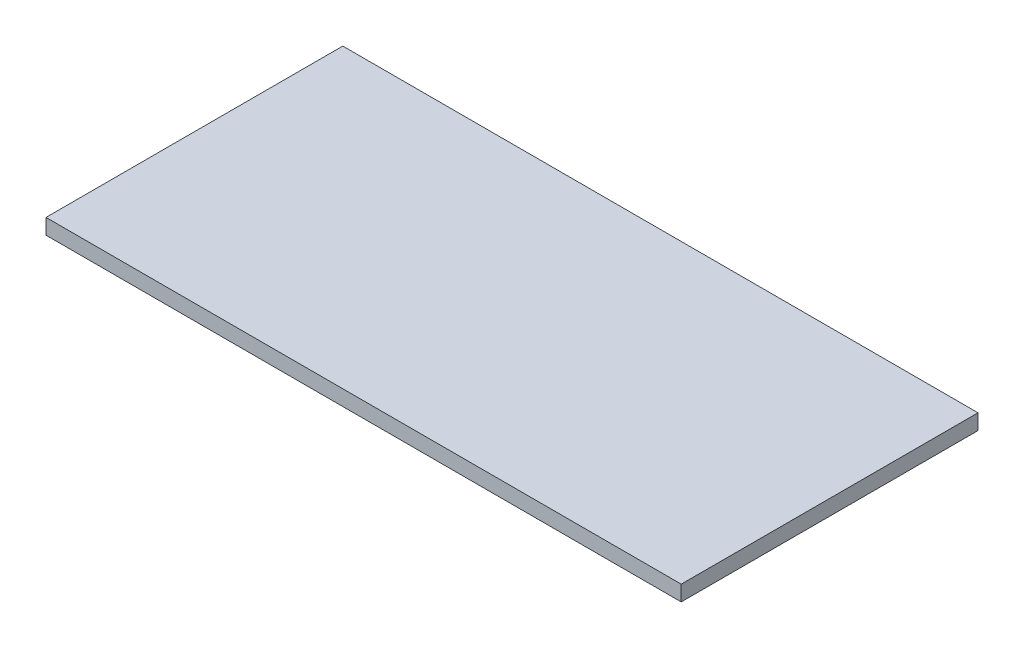
ISO-10303-21;
HEADER;
FILE_DESCRIPTION(('STEP AP214'),'2;1');
FILE_NAME('part.step','',(''),(''),'','','');
FILE_SCHEMA(('AUTOMOTIVE_DESIGN { 1 0 10303 214 1 1 1 1 }'));
ENDSEC;
DATA;
#1=APPLICATION_CONTEXT('core data for automotive mechanical design processes');
#2=APPLICATION_PROTOCOL_DEFINITION('international standard','automotive_design',2000,#1);
#3=PRODUCT_CONTEXT('',#1,'mechanical');
#4=PRODUCT('Part','Part','',(#3));
#5=PRODUCT_RELATED_PRODUCT_CATEGORY('part','',(#4));
#6=PRODUCT_DEFINITION_FORMATION('','',#4);
#7=PRODUCT_DEFINITION_CONTEXT('part definition',#1,'design');
#8=PRODUCT_DEFINITION('design','',#6,#7);
#9=PRODUCT_DEFINITION_SHAPE('','',#8);
#10=(LENGTH_UNIT() NAMED_UNIT(*) SI_UNIT(.MILLI.,.METRE.));
#11=(NAMED_UNIT(*) PLANE_ANGLE_UNIT() SI_UNIT($,.RADIAN.));
#12=(NAMED_UNIT(*) SI_UNIT($,.STERADIAN.) SOLID_ANGLE_UNIT());
#13=UNCERTAINTY_MEASURE_WITH_UNIT(LENGTH_MEASURE(1.E-05),#10,'distance_accuracy_value','');
#14=(GEOMETRIC_REPRESENTATION_CONTEXT(3) GLOBAL_UNCERTAINTY_ASSIGNED_CONTEXT((#13)) GLOBAL_UNIT_ASSIGNED_CONTEXT((#10,
#11,#12)) REPRESENTATION_CONTEXT('',''));
#15=CARTESIAN_POINT('',(0.,0.,0.));
#16=DIRECTION('',(0.,0.,1.));
#17=DIRECTION('',(1.,0.,0.));
#18=AXIS2_PLACEMENT_3D('',#15,#16,#17);
#19=CARTESIAN_POINT('',(-20.6,1.,-9.625));
#20=DIRECTION('',(1.,0.,0.));
#21=DIRECTION('',(0.,0.,-1.));
#22=AXIS2_PLACEMENT_3D('',#19,#20,#21);
#23=PLANE('',#22);
#24=DIRECTION('',(0.,0.,1.));
#25=VECTOR('',#24,1.);
#26=CARTESIAN_POINT('',(-20.6,0.,-9.625));
#27=LINE('',#26,#25);
#28=CARTESIAN_POINT('',(-20.6,0.,-9.625));
#29=VERTEX_POINT('',#28);
#30=CARTESIAN_POINT('',(-20.6,0.,9.625));
#31=VERTEX_POINT('',#30);
#32=EDGE_CURVE('E101',#29,#31,#27,.T.);
#33=ORIENTED_EDGE('',*,*,#32,.T.);
#34=DIRECTION('',(0.,-1.,0.));
#35=VECTOR('',#34,1.);
#36=CARTESIAN_POINT('',(-20.6,1.,9.625));
#37=LINE('',#36,#35);
#38=CARTESIAN_POINT('',(-20.6,1.,9.625));
#39=VERTEX_POINT('',#38);
#40=EDGE_CURVE('E11',#39,#31,#37,.T.);
#41=ORIENTED_EDGE('',*,*,#40,.F.);
#42=DIRECTION('',(0.,0.,1.));
#43=VECTOR('',#42,1.);
#44=CARTESIAN_POINT('',(-20.6,1.,-9.625));
#45=LINE('',#44,#43);
#46=CARTESIAN_POINT('',(-20.6,1.,-9.625));
#47=VERTEX_POINT('',#46);
#48=EDGE_CURVE('E89',#47,#39,#45,.T.);
#49=ORIENTED_EDGE('',*,*,#48,.F.);
#50=DIRECTION('',(0.,-1.,0.));
#51=VECTOR('',#50,1.);
#52=CARTESIAN_POINT('',(-20.6,1.,-9.625));
#53=LINE('',#52,#51);
#54=EDGE_CURVE('E97',#47,#29,#53,.T.);
#55=ORIENTED_EDGE('',*,*,#54,.T.);
#56=EDGE_LOOP('',(#33,#41,#49,#55));
#57=FACE_BOUND('',#56,.T.);
#58=ADVANCED_FACE('F38',(#57),#23,.F.);
#59=CARTESIAN_POINT('',(-20.6,1.,9.625));
#60=DIRECTION('',(0.,0.,-1.));
#61=DIRECTION('',(-1.,0.,0.));
#62=AXIS2_PLACEMENT_3D('',#59,#60,#61);
#63=PLANE('',#62);
#64=DIRECTION('',(1.,0.,0.));
#65=VECTOR('',#64,1.);
#66=CARTESIAN_POINT('',(-20.6,0.,9.625));
#67=LINE('',#66,#65);
#68=CARTESIAN_POINT('',(20.6,0.,9.625));
#69=VERTEX_POINT('',#68);
#70=EDGE_CURVE('E93',#31,#69,#67,.T.);
#71=ORIENTED_EDGE('',*,*,#70,.T.);
#72=DIRECTION('',(0.,-1.,0.));
#73=VECTOR('',#72,1.);
#74=CARTESIAN_POINT('',(20.6,1.,9.625));
#75=LINE('',#74,#73);
#76=CARTESIAN_POINT('',(20.6,1.,9.625));
#77=VERTEX_POINT('',#76);
#78=EDGE_CURVE('E46',#77,#69,#75,.T.);
#79=ORIENTED_EDGE('',*,*,#78,.F.);
#80=DIRECTION('',(1.,0.,0.));
#81=VECTOR('',#80,1.);
#82=CARTESIAN_POINT('',(-20.6,1.,9.625));
#83=LINE('',#82,#81);
#84=EDGE_CURVE('E84',#39,#77,#83,.T.);
#85=ORIENTED_EDGE('',*,*,#84,.F.);
#86=ORIENTED_EDGE('',*,*,#40,.T.);
#87=EDGE_LOOP('',(#71,#79,#85,#86));
#88=FACE_BOUND('',#87,.T.);
#89=ADVANCED_FACE('F92',(#88),#63,.F.);
#90=CARTESIAN_POINT('',(20.6,1.,-9.625));
#91=DIRECTION('',(-1.,0.,0.));
#92=DIRECTION('',(0.,0.,1.));
#93=AXIS2_PLACEMENT_3D('',#90,#91,#92);
#94=PLANE('',#93);
#95=DIRECTION('',(0.,0.,-1.));
#96=VECTOR('',#95,1.);
#97=CARTESIAN_POINT('',(20.6,0.,-9.625));
#98=LINE('',#97,#96);
#99=CARTESIAN_POINT('',(20.6,0.,-9.625));
#100=VERTEX_POINT('',#99);
#101=EDGE_CURVE('E71',#69,#100,#98,.T.);
#102=ORIENTED_EDGE('',*,*,#101,.T.);
#103=DIRECTION('',(0.,-1.,0.));
#104=VECTOR('',#103,1.);
#105=CARTESIAN_POINT('',(20.6,1.,-9.625));
#106=LINE('',#105,#104);
#107=CARTESIAN_POINT('',(20.6,1.,-9.625));
#108=VERTEX_POINT('',#107);
#109=EDGE_CURVE('E94',#108,#100,#106,.T.);
#110=ORIENTED_EDGE('',*,*,#109,.F.);
#111=DIRECTION('',(0.,0.,-1.));
#112=VECTOR('',#111,1.);
#113=CARTESIAN_POINT('',(20.6,1.,-9.625));
#114=LINE('',#113,#112);
#115=EDGE_CURVE('E87',#77,#108,#114,.T.);
#116=ORIENTED_EDGE('',*,*,#115,.F.);
#117=ORIENTED_EDGE('',*,*,#78,.T.);
#118=EDGE_LOOP('',(#102,#110,#116,#117));
#119=FACE_BOUND('',#118,.T.);
#120=ADVANCED_FACE('F95',(#119),#94,.F.);
#121=CARTESIAN_POINT('',(-20.6,1.,-9.625));
#122=DIRECTION('',(0.,0.,1.));
#123=DIRECTION('',(1.,0.,0.));
#124=AXIS2_PLACEMENT_3D('',#121,#122,#123);
#125=PLANE('',#124);
#126=DIRECTION('',(-1.,0.,0.));
#127=VECTOR('',#126,1.);
#128=CARTESIAN_POINT('',(-20.6,0.,-9.625));
#129=LINE('',#128,#127);
#130=EDGE_CURVE('E77',#100,#29,#129,.T.);
#131=ORIENTED_EDGE('',*,*,#130,.T.);
#132=ORIENTED_EDGE('',*,*,#54,.F.);
#133=DIRECTION('',(-1.,0.,0.));
#134=VECTOR('',#133,1.);
#135=CARTESIAN_POINT('',(-20.6,1.,-9.625));
#136=LINE('',#135,#134);
#137=EDGE_CURVE('E54',#108,#47,#136,.T.);
#138=ORIENTED_EDGE('',*,*,#137,.F.);
#139=ORIENTED_EDGE('',*,*,#109,.T.);
#140=EDGE_LOOP('',(#131,#132,#138,#139));
#141=FACE_BOUND('',#140,.T.);
#142=ADVANCED_FACE('F108',(#141),#125,.F.);
#143=CARTESIAN_POINT('',(0.,1.,0.));
#144=DIRECTION('',(0.,1.,0.));
#145=DIRECTION('',(0.,0.,1.));
#146=AXIS2_PLACEMENT_3D('',#143,#144,#145);
#147=PLANE('',#146);
#148=ORIENTED_EDGE('',*,*,#48,.T.);
#149=ORIENTED_EDGE('',*,*,#84,.T.);
#150=ORIENTED_EDGE('',*,*,#115,.T.);
#151=ORIENTED_EDGE('',*,*,#137,.T.);
#152=EDGE_LOOP('',(#148,#149,#150,#151));
#153=FACE_BOUND('',#152,.T.);
#154=ADVANCED_FACE('F85',(#153),#147,.T.);
#155=CARTESIAN_POINT('',(0.,0.,0.));
#156=DIRECTION('',(0.,1.,0.));
#157=DIRECTION('',(0.,0.,1.));
#158=AXIS2_PLACEMENT_3D('',#155,#156,#157);
#159=PLANE('',#158);
#160=ORIENTED_EDGE('',*,*,#32,.F.);
#161=ORIENTED_EDGE('',*,*,#130,.F.);
#162=ORIENTED_EDGE('',*,*,#101,.F.);
#163=ORIENTED_EDGE('',*,*,#70,.F.);
#164=EDGE_LOOP('',(#160,#161,#162,#163));
#165=FACE_BOUND('',#164,.T.);
#166=ADVANCED_FACE('F111',(#165),#159,.F.);
#167=CLOSED_SHELL('',(#58,#89,#120,#142,#154,#166));
#168=MANIFOLD_SOLID_BREP('B2',#167);
#169=ADVANCED_BREP_SHAPE_REPRESENTATION('',(#18,#168),#14);
#170=SHAPE_DEFINITION_REPRESENTATION(#9,#169);
ENDSEC;
END-ISO-10303-21;
